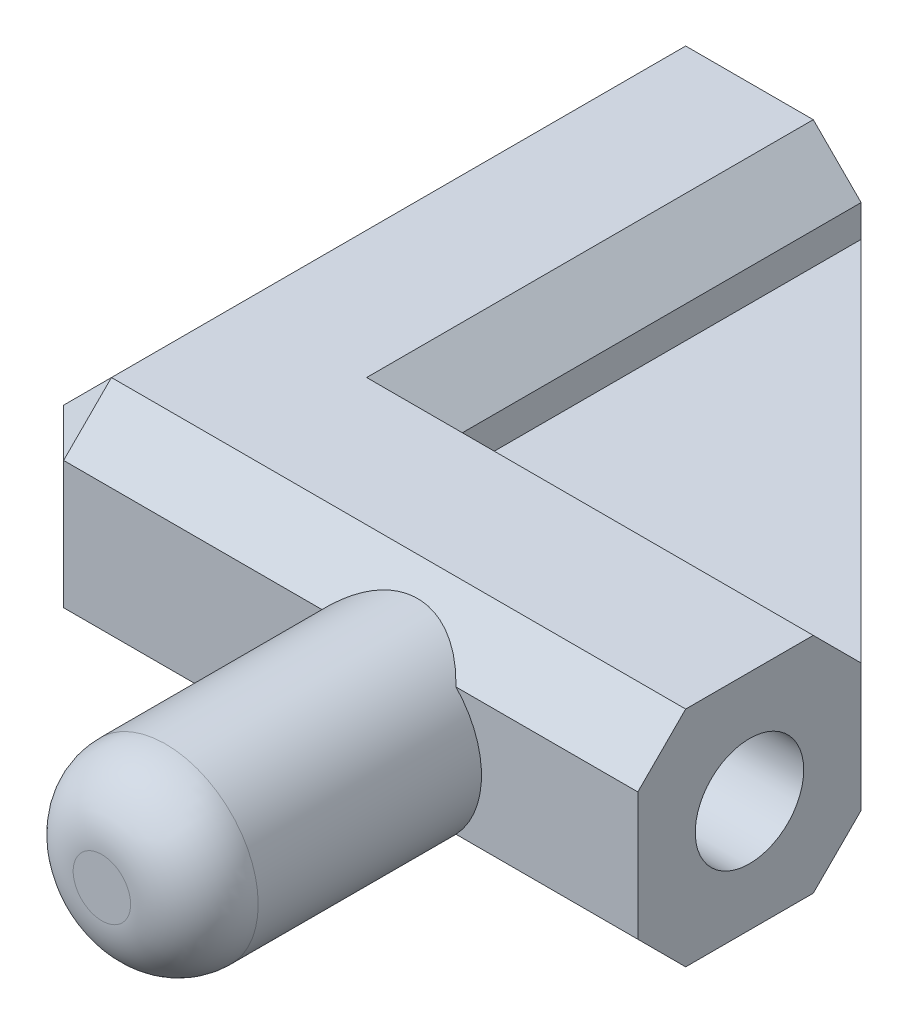
ISO-10303-21;
HEADER;
FILE_DESCRIPTION(('STEP AP214'),'2;1');
FILE_NAME('part.step','',(''),(''),'','','');
FILE_SCHEMA(('AUTOMOTIVE_DESIGN { 1 0 10303 214 1 1 1 1 }'));
ENDSEC;
DATA;
#1=APPLICATION_CONTEXT('core data for automotive mechanical design processes');
#2=APPLICATION_PROTOCOL_DEFINITION('international standard','automotive_design',2000,#1);
#3=PRODUCT_CONTEXT('',#1,'mechanical');
#4=PRODUCT('Part','Part','',(#3));
#5=PRODUCT_RELATED_PRODUCT_CATEGORY('part','',(#4));
#6=PRODUCT_DEFINITION_FORMATION('','',#4);
#7=PRODUCT_DEFINITION_CONTEXT('part definition',#1,'design');
#8=PRODUCT_DEFINITION('design','',#6,#7);
#9=PRODUCT_DEFINITION_SHAPE('','',#8);
#10=(LENGTH_UNIT() NAMED_UNIT(*) SI_UNIT(.MILLI.,.METRE.));
#11=(NAMED_UNIT(*) PLANE_ANGLE_UNIT() SI_UNIT($,.RADIAN.));
#12=(NAMED_UNIT(*) SI_UNIT($,.STERADIAN.) SOLID_ANGLE_UNIT());
#13=UNCERTAINTY_MEASURE_WITH_UNIT(LENGTH_MEASURE(1.E-05),#10,'distance_accuracy_value','');
#14=(GEOMETRIC_REPRESENTATION_CONTEXT(3) GLOBAL_UNCERTAINTY_ASSIGNED_CONTEXT((#13)) GLOBAL_UNIT_ASSIGNED_CONTEXT((#10,
#11,#12)) REPRESENTATION_CONTEXT('',''));
#15=CARTESIAN_POINT('',(0.,0.,0.));
#16=DIRECTION('',(0.,0.,1.));
#17=DIRECTION('',(1.,0.,0.));
#18=AXIS2_PLACEMENT_3D('',#15,#16,#17);
#19=CARTESIAN_POINT('',(-3.5,3.5,3.5));
#20=DIRECTION('',(0.,0.,-1.));
#21=DIRECTION('',(-1.,0.,0.));
#22=AXIS2_PLACEMENT_3D('',#19,#20,#21);
#23=PLANE('',#22);
#24=CARTESIAN_POINT('',(8.2,0.,3.5));
#25=DIRECTION('',(0.,0.,1.));
#26=DIRECTION('',(1.,0.,0.));
#27=AXIS2_PLACEMENT_3D('',#24,#25,#26);
#28=CIRCLE('',#27,2.9);
#29=CARTESIAN_POINT('',(10.3,-2.,3.5));
#30=VERTEX_POINT('',#29);
#31=CARTESIAN_POINT('',(10.3,2.,3.5));
#32=VERTEX_POINT('',#31);
#33=EDGE_CURVE('E165',#30,#32,#28,.T.);
#34=ORIENTED_EDGE('',*,*,#33,.F.);
#35=DIRECTION('',(1.,0.,0.));
#36=VECTOR('',#35,1.);
#37=CARTESIAN_POINT('',(-3.5,-2.,3.5));
#38=LINE('',#37,#36);
#39=CARTESIAN_POINT('',(16.,-2.,3.5));
#40=VERTEX_POINT('',#39);
#41=EDGE_CURVE('E195',#30,#40,#38,.T.);
#42=ORIENTED_EDGE('',*,*,#41,.T.);
#43=DIRECTION('',(0.,-1.,0.));
#44=VECTOR('',#43,1.);
#45=CARTESIAN_POINT('',(16.,3.5,3.5));
#46=LINE('',#45,#44);
#47=CARTESIAN_POINT('',(16.,2.,3.5));
#48=VERTEX_POINT('',#47);
#49=EDGE_CURVE('E399',#48,#40,#46,.T.);
#50=ORIENTED_EDGE('',*,*,#49,.F.);
#51=DIRECTION('',(-1.,0.,0.));
#52=VECTOR('',#51,1.);
#53=CARTESIAN_POINT('',(-3.5,2.,3.5));
#54=LINE('',#53,#52);
#55=EDGE_CURVE('E186',#48,#32,#54,.T.);
#56=ORIENTED_EDGE('',*,*,#55,.T.);
#57=EDGE_LOOP('',(#34,#42,#50,#56));
#58=FACE_BOUND('',#57,.T.);
#59=ADVANCED_FACE('F38',(#58),#23,.F.);
#60=CARTESIAN_POINT('',(6.1,2.,3.5));
#61=VERTEX_POINT('',#60);
#62=CARTESIAN_POINT('',(6.1,-2.,3.5));
#63=VERTEX_POINT('',#62);
#64=EDGE_CURVE('E53',#61,#63,#28,.T.);
#65=ORIENTED_EDGE('',*,*,#64,.F.);
#66=CARTESIAN_POINT('',(-2.,2.,3.5));
#67=VERTEX_POINT('',#66);
#68=EDGE_CURVE('E175',#61,#67,#54,.T.);
#69=ORIENTED_EDGE('',*,*,#68,.T.);
#70=DIRECTION('',(0.,-1.,0.));
#71=VECTOR('',#70,1.);
#72=CARTESIAN_POINT('',(-2.,3.5,3.5));
#73=LINE('',#72,#71);
#74=CARTESIAN_POINT('',(-2.,-2.,3.5));
#75=VERTEX_POINT('',#74);
#76=EDGE_CURVE('E189',#67,#75,#73,.T.);
#77=ORIENTED_EDGE('',*,*,#76,.T.);
#78=EDGE_CURVE('E178',#75,#63,#38,.T.);
#79=ORIENTED_EDGE('',*,*,#78,.T.);
#80=EDGE_LOOP('',(#65,#69,#77,#79));
#81=FACE_BOUND('',#80,.T.);
#82=ADVANCED_FACE('F174',(#81),#23,.F.);
#83=CARTESIAN_POINT('',(16.,3.5,-3.5));
#84=DIRECTION('',(0.,0.,1.));
#85=DIRECTION('',(1.,0.,0.));
#86=AXIS2_PLACEMENT_3D('',#83,#84,#85);
#87=PLANE('',#86);
#88=DIRECTION('',(0.,-1.,0.));
#89=VECTOR('',#88,1.);
#90=CARTESIAN_POINT('',(16.,3.5,-3.5));
#91=LINE('',#90,#89);
#92=CARTESIAN_POINT('',(16.,-1.,-3.5));
#93=VERTEX_POINT('',#92);
#94=CARTESIAN_POINT('',(16.,-2.,-3.5));
#95=VERTEX_POINT('',#94);
#96=EDGE_CURVE('E396',#93,#95,#91,.T.);
#97=ORIENTED_EDGE('',*,*,#96,.T.);
#98=DIRECTION('',(-1.,0.,0.));
#99=VECTOR('',#98,1.);
#100=CARTESIAN_POINT('',(16.,-2.,-3.5));
#101=LINE('',#100,#99);
#102=CARTESIAN_POINT('',(3.5,-2.,-3.5));
#103=VERTEX_POINT('',#102);
#104=EDGE_CURVE('E187',#95,#103,#101,.T.);
#105=ORIENTED_EDGE('',*,*,#104,.T.);
#106=DIRECTION('',(0.,-1.,0.));
#107=VECTOR('',#106,1.);
#108=CARTESIAN_POINT('',(3.5,3.5,-3.5));
#109=LINE('',#108,#107);
#110=CARTESIAN_POINT('',(3.5,-1.,-3.5));
#111=VERTEX_POINT('',#110);
#112=EDGE_CURVE('E381',#111,#103,#109,.T.);
#113=ORIENTED_EDGE('',*,*,#112,.F.);
#114=DIRECTION('',(1.,0.,0.));
#115=VECTOR('',#114,1.);
#116=CARTESIAN_POINT('',(16.,-1.,-3.5));
#117=LINE('',#116,#115);
#118=EDGE_CURVE('E425',#111,#93,#117,.T.);
#119=ORIENTED_EDGE('',*,*,#118,.T.);
#120=EDGE_LOOP('',(#97,#105,#113,#119));
#121=FACE_BOUND('',#120,.T.);
#122=ADVANCED_FACE('F240',(#121),#87,.F.);
#123=CARTESIAN_POINT('',(3.5,3.5,-3.5));
#124=DIRECTION('',(-1.,0.,0.));
#125=DIRECTION('',(0.,0.,1.));
#126=AXIS2_PLACEMENT_3D('',#123,#124,#125);
#127=PLANE('',#126);
#128=ORIENTED_EDGE('',*,*,#112,.T.);
#129=DIRECTION('',(0.,0.,-1.));
#130=VECTOR('',#129,1.);
#131=CARTESIAN_POINT('',(3.5,-2.,-3.5));
#132=LINE('',#131,#130);
#133=CARTESIAN_POINT('',(3.5,-2.,-16.));
#134=VERTEX_POINT('',#133);
#135=EDGE_CURVE('E353',#103,#134,#132,.T.);
#136=ORIENTED_EDGE('',*,*,#135,.T.);
#137=DIRECTION('',(0.,-1.,0.));
#138=VECTOR('',#137,1.);
#139=CARTESIAN_POINT('',(3.5,3.5,-16.));
#140=LINE('',#139,#138);
#141=CARTESIAN_POINT('',(3.5,-1.,-16.));
#142=VERTEX_POINT('',#141);
#143=EDGE_CURVE('E378',#142,#134,#140,.T.);
#144=ORIENTED_EDGE('',*,*,#143,.F.);
#145=DIRECTION('',(0.,0.,1.));
#146=VECTOR('',#145,1.);
#147=CARTESIAN_POINT('',(3.5,-1.,-3.5));
#148=LINE('',#147,#146);
#149=EDGE_CURVE('E204',#142,#111,#148,.T.);
#150=ORIENTED_EDGE('',*,*,#149,.T.);
#151=EDGE_LOOP('',(#128,#136,#144,#150));
#152=FACE_BOUND('',#151,.T.);
#153=ADVANCED_FACE('F251',(#152),#127,.F.);
#154=CARTESIAN_POINT('',(3.5,3.5,-16.));
#155=DIRECTION('',(0.,0.,1.));
#156=DIRECTION('',(1.,0.,0.));
#157=AXIS2_PLACEMENT_3D('',#154,#155,#156);
#158=PLANE('',#157);
#159=CARTESIAN_POINT('',(0.,0.,-16.));
#160=DIRECTION('',(0.,0.,-1.));
#161=DIRECTION('',(-1.,0.,0.));
#162=AXIS2_PLACEMENT_3D('',#159,#160,#161);
#163=CIRCLE('',#162,1.7);
#164=CARTESIAN_POINT('',(-1.7,0.,-16.));
#165=VERTEX_POINT('',#164);
#166=EDGE_CURVE('E444',#165,#165,#163,.T.);
#167=ORIENTED_EDGE('',*,*,#166,.F.);
#168=EDGE_LOOP('',(#167));
#169=FACE_BOUND('',#168,.T.);
#170=DIRECTION('',(-1.,0.,0.));
#171=VECTOR('',#170,1.);
#172=CARTESIAN_POINT('',(3.5,3.5,-16.));
#173=LINE('',#172,#171);
#174=CARTESIAN_POINT('',(2.,3.5,-16.));
#175=VERTEX_POINT('',#174);
#176=CARTESIAN_POINT('',(-2.,3.5,-16.));
#177=VERTEX_POINT('',#176);
#178=EDGE_CURVE('E388',#175,#177,#173,.T.);
#179=ORIENTED_EDGE('',*,*,#178,.F.);
#180=DIRECTION('',(0.707106781186546,-0.707106781186549,0.));
#181=VECTOR('',#180,1.);
#182=CARTESIAN_POINT('',(2.,3.5,-16.));
#183=LINE('',#182,#181);
#184=CARTESIAN_POINT('',(3.5,2.,-16.));
#185=VERTEX_POINT('',#184);
#186=EDGE_CURVE('E349',#175,#185,#183,.T.);
#187=ORIENTED_EDGE('',*,*,#186,.T.);
#188=CARTESIAN_POINT('',(3.5,1.,-16.));
#189=VERTEX_POINT('',#188);
#190=EDGE_CURVE('E384',#185,#189,#140,.T.);
#191=ORIENTED_EDGE('',*,*,#190,.T.);
#192=DIRECTION('',(0.,-1.,0.));
#193=VECTOR('',#192,1.);
#194=CARTESIAN_POINT('',(3.5,1.,-16.));
#195=LINE('',#194,#193);
#196=EDGE_CURVE('E383',#189,#142,#195,.T.);
#197=ORIENTED_EDGE('',*,*,#196,.T.);
#198=ORIENTED_EDGE('',*,*,#143,.T.);
#199=DIRECTION('',(0.707106781186548,0.707106781186547,0.));
#200=VECTOR('',#199,1.);
#201=CARTESIAN_POINT('',(3.5,-2.,-16.));
#202=LINE('',#201,#200);
#203=CARTESIAN_POINT('',(2.,-3.5,-16.));
#204=VERTEX_POINT('',#203);
#205=EDGE_CURVE('E342',#134,#204,#202,.F.);
#206=ORIENTED_EDGE('',*,*,#205,.T.);
#207=DIRECTION('',(-1.,0.,0.));
#208=VECTOR('',#207,1.);
#209=CARTESIAN_POINT('',(3.5,-3.5,-16.));
#210=LINE('',#209,#208);
#211=CARTESIAN_POINT('',(-2.,-3.5,-16.));
#212=VERTEX_POINT('',#211);
#213=EDGE_CURVE('E369',#204,#212,#210,.T.);
#214=ORIENTED_EDGE('',*,*,#213,.T.);
#215=DIRECTION('',(0.707106781186547,-0.707106781186548,0.));
#216=VECTOR('',#215,1.);
#217=CARTESIAN_POINT('',(-3.5,-2.,-16.));
#218=LINE('',#217,#216);
#219=CARTESIAN_POINT('',(-3.5,-2.,-16.));
#220=VERTEX_POINT('',#219);
#221=EDGE_CURVE('E339',#212,#220,#218,.F.);
#222=ORIENTED_EDGE('',*,*,#221,.T.);
#223=DIRECTION('',(0.,-1.,0.));
#224=VECTOR('',#223,1.);
#225=CARTESIAN_POINT('',(-3.5,3.5,-16.));
#226=LINE('',#225,#224);
#227=CARTESIAN_POINT('',(-3.5,2.,-16.));
#228=VERTEX_POINT('',#227);
#229=EDGE_CURVE('E402',#228,#220,#226,.T.);
#230=ORIENTED_EDGE('',*,*,#229,.F.);
#231=DIRECTION('',(0.707106781186547,0.707106781186548,0.));
#232=VECTOR('',#231,1.);
#233=CARTESIAN_POINT('',(-2.,3.5,-16.));
#234=LINE('',#233,#232);
#235=EDGE_CURVE('E332',#228,#177,#234,.T.);
#236=ORIENTED_EDGE('',*,*,#235,.T.);
#237=EDGE_LOOP('',(#179,#187,#191,#197,#198,#206,#214,#222,#230,#236));
#238=FACE_BOUND('',#237,.T.);
#239=ADVANCED_FACE('F248',(#169,#238),#158,.F.);
#240=CARTESIAN_POINT('',(-3.5,3.5,-16.));
#241=DIRECTION('',(1.,0.,0.));
#242=DIRECTION('',(0.,0.,-1.));
#243=AXIS2_PLACEMENT_3D('',#240,#241,#242);
#244=PLANE('',#243);
#245=ORIENTED_EDGE('',*,*,#229,.T.);
#246=DIRECTION('',(0.,0.,1.));
#247=VECTOR('',#246,1.);
#248=CARTESIAN_POINT('',(-3.5,-2.,-16.));
#249=LINE('',#248,#247);
#250=CARTESIAN_POINT('',(-3.5,-2.,2.));
#251=VERTEX_POINT('',#250);
#252=EDGE_CURVE('E61',#220,#251,#249,.T.);
#253=ORIENTED_EDGE('',*,*,#252,.T.);
#254=DIRECTION('',(0.,1.,0.));
#255=VECTOR('',#254,1.);
#256=CARTESIAN_POINT('',(-3.5,3.5,2.));
#257=LINE('',#256,#255);
#258=CARTESIAN_POINT('',(-3.5,2.,2.));
#259=VERTEX_POINT('',#258);
#260=EDGE_CURVE('E199',#251,#259,#257,.T.);
#261=ORIENTED_EDGE('',*,*,#260,.T.);
#262=DIRECTION('',(0.,0.,-1.));
#263=VECTOR('',#262,1.);
#264=CARTESIAN_POINT('',(-3.5,2.,-16.));
#265=LINE('',#264,#263);
#266=EDGE_CURVE('E197',#259,#228,#265,.T.);
#267=ORIENTED_EDGE('',*,*,#266,.T.);
#268=EDGE_LOOP('',(#245,#253,#261,#267));
#269=FACE_BOUND('',#268,.T.);
#270=ADVANCED_FACE('F245',(#269),#244,.F.);
#271=CARTESIAN_POINT('',(16.,3.5,3.5));
#272=DIRECTION('',(-1.,0.,0.));
#273=DIRECTION('',(0.,0.,1.));
#274=AXIS2_PLACEMENT_3D('',#271,#272,#273);
#275=PLANE('',#274);
#276=CARTESIAN_POINT('',(16.,0.,0.));
#277=DIRECTION('',(1.,0.,0.));
#278=DIRECTION('',(0.,0.,-1.));
#279=AXIS2_PLACEMENT_3D('',#276,#277,#278);
#280=CIRCLE('',#279,1.7);
#281=CARTESIAN_POINT('',(16.,0.,-1.7));
#282=VERTEX_POINT('',#281);
#283=EDGE_CURVE('E440',#282,#282,#280,.T.);
#284=ORIENTED_EDGE('',*,*,#283,.F.);
#285=EDGE_LOOP('',(#284));
#286=FACE_BOUND('',#285,.T.);
#287=CARTESIAN_POINT('',(16.,2.,-3.5));
#288=VERTEX_POINT('',#287);
#289=CARTESIAN_POINT('',(16.,1.,-3.5));
#290=VERTEX_POINT('',#289);
#291=EDGE_CURVE('E397',#288,#290,#91,.T.);
#292=ORIENTED_EDGE('',*,*,#291,.F.);
#293=DIRECTION('',(0.,0.707106781186548,0.707106781186547));
#294=VECTOR('',#293,1.);
#295=CARTESIAN_POINT('',(16.,3.5,-2.));
#296=LINE('',#295,#294);
#297=CARTESIAN_POINT('',(16.,3.5,-2.));
#298=VERTEX_POINT('',#297);
#299=EDGE_CURVE('E340',#288,#298,#296,.T.);
#300=ORIENTED_EDGE('',*,*,#299,.T.);
#301=DIRECTION('',(0.,0.,-1.));
#302=VECTOR('',#301,1.);
#303=CARTESIAN_POINT('',(16.,3.5,3.5));
#304=LINE('',#303,#302);
#305=CARTESIAN_POINT('',(16.,3.5,2.));
#306=VERTEX_POINT('',#305);
#307=EDGE_CURVE('E385',#306,#298,#304,.T.);
#308=ORIENTED_EDGE('',*,*,#307,.F.);
#309=DIRECTION('',(0.,-0.707106781186548,0.707106781186547));
#310=VECTOR('',#309,1.);
#311=CARTESIAN_POINT('',(16.,3.5,2.));
#312=LINE('',#311,#310);
#313=EDGE_CURVE('E414',#306,#48,#312,.T.);
#314=ORIENTED_EDGE('',*,*,#313,.T.);
#315=ORIENTED_EDGE('',*,*,#49,.T.);
#316=DIRECTION('',(0.,0.707106781186547,0.707106781186548));
#317=VECTOR('',#316,1.);
#318=CARTESIAN_POINT('',(16.,-2.,3.5));
#319=LINE('',#318,#317);
#320=CARTESIAN_POINT('',(16.,-3.5,2.));
#321=VERTEX_POINT('',#320);
#322=EDGE_CURVE('E416',#40,#321,#319,.F.);
#323=ORIENTED_EDGE('',*,*,#322,.T.);
#324=DIRECTION('',(0.,0.,-1.));
#325=VECTOR('',#324,1.);
#326=CARTESIAN_POINT('',(16.,-3.5,3.5));
#327=LINE('',#326,#325);
#328=CARTESIAN_POINT('',(16.,-3.5,-2.));
#329=VERTEX_POINT('',#328);
#330=EDGE_CURVE('E392',#321,#329,#327,.T.);
#331=ORIENTED_EDGE('',*,*,#330,.T.);
#332=DIRECTION('',(0.,-0.707106781186547,0.707106781186548));
#333=VECTOR('',#332,1.);
#334=CARTESIAN_POINT('',(16.,-2.,-3.5));
#335=LINE('',#334,#333);
#336=EDGE_CURVE('E344',#329,#95,#335,.F.);
#337=ORIENTED_EDGE('',*,*,#336,.T.);
#338=ORIENTED_EDGE('',*,*,#96,.F.);
#339=DIRECTION('',(0.,-1.,0.));
#340=VECTOR('',#339,1.);
#341=CARTESIAN_POINT('',(16.,1.,-3.5));
#342=LINE('',#341,#340);
#343=EDGE_CURVE('E437',#290,#93,#342,.T.);
#344=ORIENTED_EDGE('',*,*,#343,.F.);
#345=EDGE_LOOP('',(#292,#300,#308,#314,#315,#323,#331,#337,#338,#344));
#346=FACE_BOUND('',#345,.T.);
#347=ADVANCED_FACE('F243',(#286,#346),#275,.F.);
#348=CARTESIAN_POINT('',(3.5,2.,-3.5));
#349=VERTEX_POINT('',#348);
#350=CARTESIAN_POINT('',(3.5,1.,-3.5));
#351=VERTEX_POINT('',#350);
#352=EDGE_CURVE('E394',#349,#351,#109,.T.);
#353=ORIENTED_EDGE('',*,*,#352,.F.);
#354=DIRECTION('',(1.,0.,0.));
#355=VECTOR('',#354,1.);
#356=CARTESIAN_POINT('',(16.,2.,-3.5));
#357=LINE('',#356,#355);
#358=EDGE_CURVE('E412',#349,#288,#357,.T.);
#359=ORIENTED_EDGE('',*,*,#358,.T.);
#360=ORIENTED_EDGE('',*,*,#291,.T.);
#361=DIRECTION('',(1.,0.,0.));
#362=VECTOR('',#361,1.);
#363=CARTESIAN_POINT('',(16.,1.,-3.5));
#364=LINE('',#363,#362);
#365=EDGE_CURVE('E465',#351,#290,#364,.T.);
#366=ORIENTED_EDGE('',*,*,#365,.F.);
#367=EDGE_LOOP('',(#353,#359,#360,#366));
#368=FACE_BOUND('',#367,.T.);
#369=ADVANCED_FACE('F509',(#368),#87,.F.);
#370=ORIENTED_EDGE('',*,*,#190,.F.);
#371=DIRECTION('',(0.,0.,1.));
#372=VECTOR('',#371,1.);
#373=CARTESIAN_POINT('',(3.5,2.,-3.5));
#374=LINE('',#373,#372);
#375=EDGE_CURVE('E351',#185,#349,#374,.T.);
#376=ORIENTED_EDGE('',*,*,#375,.T.);
#377=ORIENTED_EDGE('',*,*,#352,.T.);
#378=DIRECTION('',(0.,0.,1.));
#379=VECTOR('',#378,1.);
#380=CARTESIAN_POINT('',(3.5,1.,-3.5));
#381=LINE('',#380,#379);
#382=EDGE_CURVE('E431',#189,#351,#381,.T.);
#383=ORIENTED_EDGE('',*,*,#382,.F.);
#384=EDGE_LOOP('',(#370,#376,#377,#383));
#385=FACE_BOUND('',#384,.T.);
#386=ADVANCED_FACE('F504',(#385),#127,.F.);
#387=CARTESIAN_POINT('',(0.,3.5,0.));
#388=DIRECTION('',(0.,1.,0.));
#389=DIRECTION('',(0.,0.,1.));
#390=AXIS2_PLACEMENT_3D('',#387,#388,#389);
#391=PLANE('',#390);
#392=ORIENTED_EDGE('',*,*,#307,.T.);
#393=DIRECTION('',(-1.,0.,0.));
#394=VECTOR('',#393,1.);
#395=CARTESIAN_POINT('',(3.5,3.5,-2.));
#396=LINE('',#395,#394);
#397=CARTESIAN_POINT('',(2.,3.5,-2.));
#398=VERTEX_POINT('',#397);
#399=EDGE_CURVE('E409',#298,#398,#396,.T.);
#400=ORIENTED_EDGE('',*,*,#399,.T.);
#401=DIRECTION('',(0.,0.,-1.));
#402=VECTOR('',#401,1.);
#403=CARTESIAN_POINT('',(2.,3.5,-16.));
#404=LINE('',#403,#402);
#405=EDGE_CURVE('E407',#398,#175,#404,.T.);
#406=ORIENTED_EDGE('',*,*,#405,.T.);
#407=ORIENTED_EDGE('',*,*,#178,.T.);
#408=DIRECTION('',(0.,0.,1.));
#409=VECTOR('',#408,1.);
#410=CARTESIAN_POINT('',(-2.,3.5,3.5));
#411=LINE('',#410,#409);
#412=CARTESIAN_POINT('',(-2.,3.5,2.));
#413=VERTEX_POINT('',#412);
#414=EDGE_CURVE('E334',#177,#413,#411,.T.);
#415=ORIENTED_EDGE('',*,*,#414,.T.);
#416=DIRECTION('',(1.,0.,0.));
#417=VECTOR('',#416,1.);
#418=CARTESIAN_POINT('',(16.,3.5,2.));
#419=LINE('',#418,#417);
#420=EDGE_CURVE('E405',#413,#306,#419,.T.);
#421=ORIENTED_EDGE('',*,*,#420,.T.);
#422=EDGE_LOOP('',(#392,#400,#406,#407,#415,#421));
#423=FACE_BOUND('',#422,.T.);
#424=ADVANCED_FACE('F501',(#423),#391,.T.);
#425=CARTESIAN_POINT('',(0.,-3.5,0.));
#426=DIRECTION('',(0.,1.,0.));
#427=DIRECTION('',(0.,0.,1.));
#428=AXIS2_PLACEMENT_3D('',#425,#426,#427);
#429=PLANE('',#428);
#430=ORIENTED_EDGE('',*,*,#213,.F.);
#431=DIRECTION('',(0.,0.,1.));
#432=VECTOR('',#431,1.);
#433=CARTESIAN_POINT('',(2.,-3.5,0.));
#434=LINE('',#433,#432);
#435=CARTESIAN_POINT('',(2.,-3.5,-2.));
#436=VERTEX_POINT('',#435);
#437=EDGE_CURVE('E190',#204,#436,#434,.T.);
#438=ORIENTED_EDGE('',*,*,#437,.T.);
#439=DIRECTION('',(1.,0.,0.));
#440=VECTOR('',#439,1.);
#441=CARTESIAN_POINT('',(0.,-3.5,-2.));
#442=LINE('',#441,#440);
#443=EDGE_CURVE('E360',#436,#329,#442,.T.);
#444=ORIENTED_EDGE('',*,*,#443,.T.);
#445=ORIENTED_EDGE('',*,*,#330,.F.);
#446=DIRECTION('',(-1.,0.,0.));
#447=VECTOR('',#446,1.);
#448=CARTESIAN_POINT('',(0.,-3.5,2.));
#449=LINE('',#448,#447);
#450=CARTESIAN_POINT('',(-2.,-3.5,2.));
#451=VERTEX_POINT('',#450);
#452=EDGE_CURVE('E358',#321,#451,#449,.T.);
#453=ORIENTED_EDGE('',*,*,#452,.T.);
#454=DIRECTION('',(0.,0.,-1.));
#455=VECTOR('',#454,1.);
#456=CARTESIAN_POINT('',(-2.,-3.5,0.));
#457=LINE('',#456,#455);
#458=EDGE_CURVE('E356',#451,#212,#457,.T.);
#459=ORIENTED_EDGE('',*,*,#458,.T.);
#460=EDGE_LOOP('',(#430,#438,#444,#445,#453,#459));
#461=FACE_BOUND('',#460,.T.);
#462=ADVANCED_FACE('F365',(#461),#429,.F.);
#463=CARTESIAN_POINT('',(0.,0.,-2.));
#464=DIRECTION('',(0.,0.,-1.));
#465=DIRECTION('',(-1.,0.,0.));
#466=AXIS2_PLACEMENT_3D('',#463,#464,#465);
#467=CYLINDRICAL_SURFACE('',#466,1.7);
#468=CARTESIAN_POINT('',(0.,0.,-2.));
#469=DIRECTION('',(0.,0.,-1.));
#470=DIRECTION('',(-1.,0.,0.));
#471=AXIS2_PLACEMENT_3D('',#468,#469,#470);
#472=CIRCLE('',#471,1.7);
#473=CARTESIAN_POINT('',(-1.7,0.,-2.));
#474=VERTEX_POINT('',#473);
#475=EDGE_CURVE('E447',#474,#474,#472,.T.);
#476=ORIENTED_EDGE('',*,*,#475,.F.);
#477=EDGE_LOOP('',(#476));
#478=FACE_BOUND('',#477,.T.);
#479=ORIENTED_EDGE('',*,*,#166,.T.);
#480=EDGE_LOOP('',(#479));
#481=FACE_BOUND('',#480,.T.);
#482=ADVANCED_FACE('F496',(#478,#481),#467,.F.);
#483=CARTESIAN_POINT('',(0.,0.,-2.));
#484=DIRECTION('',(0.,0.,-1.));
#485=DIRECTION('',(-1.,0.,0.));
#486=AXIS2_PLACEMENT_3D('',#483,#484,#485);
#487=PLANE('',#486);
#488=ORIENTED_EDGE('',*,*,#475,.T.);
#489=EDGE_LOOP('',(#488));
#490=FACE_BOUND('',#489,.T.);
#491=ADVANCED_FACE('F492',(#490),#487,.T.);
#492=CARTESIAN_POINT('',(2.,0.,0.));
#493=DIRECTION('',(1.,0.,0.));
#494=DIRECTION('',(0.,0.,-1.));
#495=AXIS2_PLACEMENT_3D('',#492,#493,#494);
#496=CYLINDRICAL_SURFACE('',#495,1.7);
#497=CARTESIAN_POINT('',(2.,0.,0.));
#498=DIRECTION('',(1.,0.,0.));
#499=DIRECTION('',(0.,0.,-1.));
#500=AXIS2_PLACEMENT_3D('',#497,#498,#499);
#501=CIRCLE('',#500,1.7);
#502=CARTESIAN_POINT('',(2.,0.,-1.7));
#503=VERTEX_POINT('',#502);
#504=EDGE_CURVE('E441',#503,#503,#501,.T.);
#505=ORIENTED_EDGE('',*,*,#504,.F.);
#506=EDGE_LOOP('',(#505));
#507=FACE_BOUND('',#506,.T.);
#508=ORIENTED_EDGE('',*,*,#283,.T.);
#509=EDGE_LOOP('',(#508));
#510=FACE_BOUND('',#509,.T.);
#511=ADVANCED_FACE('F488',(#507,#510),#496,.F.);
#512=CARTESIAN_POINT('',(2.,0.,0.));
#513=DIRECTION('',(1.,0.,0.));
#514=DIRECTION('',(0.,0.,-1.));
#515=AXIS2_PLACEMENT_3D('',#512,#513,#514);
#516=PLANE('',#515);
#517=ORIENTED_EDGE('',*,*,#504,.T.);
#518=EDGE_LOOP('',(#517));
#519=FACE_BOUND('',#518,.T.);
#520=ADVANCED_FACE('F485',(#519),#516,.T.);
#521=CARTESIAN_POINT('',(3.5,1.,-16.));
#522=DIRECTION('',(-0.707106781186547,0.,0.707106781186547));
#523=DIRECTION('',(0.707106781186548,0.,0.707106781186548));
#524=AXIS2_PLACEMENT_3D('',#521,#522,#523);
#525=PLANE('',#524);
#526=DIRECTION('',(-0.707106781186547,0.,-0.707106781186547));
#527=VECTOR('',#526,1.);
#528=CARTESIAN_POINT('',(3.5,-1.,-16.));
#529=LINE('',#528,#527);
#530=EDGE_CURVE('E429',#93,#142,#529,.T.);
#531=ORIENTED_EDGE('',*,*,#530,.T.);
#532=ORIENTED_EDGE('',*,*,#196,.F.);
#533=DIRECTION('',(-0.707106781186547,0.,-0.707106781186547));
#534=VECTOR('',#533,1.);
#535=CARTESIAN_POINT('',(3.5,1.,-16.));
#536=LINE('',#535,#534);
#537=EDGE_CURVE('E438',#290,#189,#536,.T.);
#538=ORIENTED_EDGE('',*,*,#537,.F.);
#539=ORIENTED_EDGE('',*,*,#343,.T.);
#540=EDGE_LOOP('',(#531,#532,#538,#539));
#541=FACE_BOUND('',#540,.T.);
#542=ADVANCED_FACE('F474',(#541),#525,.F.);
#543=CARTESIAN_POINT('',(0.,1.,0.));
#544=DIRECTION('',(0.,1.,0.));
#545=DIRECTION('',(0.,0.,1.));
#546=AXIS2_PLACEMENT_3D('',#543,#544,#545);
#547=PLANE('',#546);
#548=ORIENTED_EDGE('',*,*,#382,.T.);
#549=ORIENTED_EDGE('',*,*,#365,.T.);
#550=ORIENTED_EDGE('',*,*,#537,.T.);
#551=EDGE_LOOP('',(#548,#549,#550));
#552=FACE_BOUND('',#551,.T.);
#553=ADVANCED_FACE('F470',(#552),#547,.T.);
#554=CARTESIAN_POINT('',(0.,-1.,0.));
#555=DIRECTION('',(0.,1.,0.));
#556=DIRECTION('',(0.,0.,1.));
#557=AXIS2_PLACEMENT_3D('',#554,#555,#556);
#558=PLANE('',#557);
#559=ORIENTED_EDGE('',*,*,#149,.F.);
#560=ORIENTED_EDGE('',*,*,#530,.F.);
#561=ORIENTED_EDGE('',*,*,#118,.F.);
#562=EDGE_LOOP('',(#559,#560,#561));
#563=FACE_BOUND('',#562,.T.);
#564=ADVANCED_FACE('F268',(#563),#558,.F.);
#565=CARTESIAN_POINT('',(2.,3.5,0.));
#566=DIRECTION('',(0.707106781186549,0.707106781186546,0.));
#567=DIRECTION('',(0.,0.,1.));
#568=AXIS2_PLACEMENT_3D('',#565,#566,#567);
#569=PLANE('',#568);
#570=ORIENTED_EDGE('',*,*,#186,.F.);
#571=ORIENTED_EDGE('',*,*,#405,.F.);
#572=DIRECTION('',(0.577350269189625,-0.577350269189627,-0.577350269189625));
#573=VECTOR('',#572,1.);
#574=CARTESIAN_POINT('',(1.33333333333334,4.16666666666667,-1.33333333333334));
#575=LINE('',#574,#573);
#576=EDGE_CURVE('E202',#349,#398,#575,.F.);
#577=ORIENTED_EDGE('',*,*,#576,.F.);
#578=ORIENTED_EDGE('',*,*,#375,.F.);
#579=EDGE_LOOP('',(#570,#571,#577,#578));
#580=FACE_BOUND('',#579,.T.);
#581=ADVANCED_FACE('F262',(#580),#569,.T.);
#582=CARTESIAN_POINT('',(0.,3.5,-2.));
#583=DIRECTION('',(0.,0.707106781186547,-0.707106781186548));
#584=DIRECTION('',(1.,0.,0.));
#585=AXIS2_PLACEMENT_3D('',#582,#583,#584);
#586=PLANE('',#585);
#587=ORIENTED_EDGE('',*,*,#299,.F.);
#588=ORIENTED_EDGE('',*,*,#358,.F.);
#589=ORIENTED_EDGE('',*,*,#576,.T.);
#590=ORIENTED_EDGE('',*,*,#399,.F.);
#591=EDGE_LOOP('',(#587,#588,#589,#590));
#592=FACE_BOUND('',#591,.T.);
#593=ADVANCED_FACE('F254',(#592),#586,.T.);
#594=CARTESIAN_POINT('',(16.,-2.,-3.5));
#595=DIRECTION('',(0.,0.707106781186548,0.707106781186547));
#596=DIRECTION('',(-1.,0.,0.));
#597=AXIS2_PLACEMENT_3D('',#594,#595,#596);
#598=PLANE('',#597);
#599=ORIENTED_EDGE('',*,*,#336,.F.);
#600=ORIENTED_EDGE('',*,*,#443,.F.);
#601=DIRECTION('',(0.577350269189626,0.577350269189625,-0.577350269189626));
#602=VECTOR('',#601,1.);
#603=CARTESIAN_POINT('',(3.5,-2.,-3.5));
#604=LINE('',#603,#602);
#605=EDGE_CURVE('E205',#103,#436,#604,.F.);
#606=ORIENTED_EDGE('',*,*,#605,.F.);
#607=ORIENTED_EDGE('',*,*,#104,.F.);
#608=EDGE_LOOP('',(#599,#600,#606,#607));
#609=FACE_BOUND('',#608,.T.);
#610=ADVANCED_FACE('F261',(#609),#598,.F.);
#611=CARTESIAN_POINT('',(3.5,-2.,-3.5));
#612=DIRECTION('',(-0.707106781186547,0.707106781186548,0.));
#613=DIRECTION('',(0.,0.,-1.));
#614=AXIS2_PLACEMENT_3D('',#611,#612,#613);
#615=PLANE('',#614);
#616=ORIENTED_EDGE('',*,*,#605,.T.);
#617=ORIENTED_EDGE('',*,*,#437,.F.);
#618=ORIENTED_EDGE('',*,*,#205,.F.);
#619=ORIENTED_EDGE('',*,*,#135,.F.);
#620=EDGE_LOOP('',(#616,#617,#618,#619));
#621=FACE_BOUND('',#620,.T.);
#622=ADVANCED_FACE('F271',(#621),#615,.F.);
#623=CARTESIAN_POINT('',(-2.,3.5,0.));
#624=DIRECTION('',(-0.707106781186548,0.707106781186547,0.));
#625=DIRECTION('',(0.,0.,-1.));
#626=AXIS2_PLACEMENT_3D('',#623,#624,#625);
#627=PLANE('',#626);
#628=ORIENTED_EDGE('',*,*,#235,.F.);
#629=ORIENTED_EDGE('',*,*,#266,.F.);
#630=DIRECTION('',(-0.707106781186546,-0.707106781186548,0.));
#631=VECTOR('',#630,1.);
#632=CARTESIAN_POINT('',(-3.5,2.,2.));
#633=LINE('',#632,#631);
#634=EDGE_CURVE('E208',#413,#259,#633,.T.);
#635=ORIENTED_EDGE('',*,*,#634,.F.);
#636=ORIENTED_EDGE('',*,*,#414,.F.);
#637=EDGE_LOOP('',(#628,#629,#635,#636));
#638=FACE_BOUND('',#637,.T.);
#639=ADVANCED_FACE('F277',(#638),#627,.T.);
#640=CARTESIAN_POINT('',(0.,3.5,2.));
#641=DIRECTION('',(0.,0.707106781186547,0.707106781186548));
#642=DIRECTION('',(-1.,0.,0.));
#643=AXIS2_PLACEMENT_3D('',#640,#641,#642);
#644=PLANE('',#643);
#645=ORIENTED_EDGE('',*,*,#68,.F.);
#646=CARTESIAN_POINT('',(8.2,0.,5.49999999999999));
#647=DIRECTION('',(0.,0.707106781186547,0.707106781186548));
#648=DIRECTION('',(0.,-0.707106781186548,0.707106781186547));
#649=AXIS2_PLACEMENT_3D('',#646,#647,#648);
#650=ELLIPSE('',#649,4.10121933088197,2.9);
#651=EDGE_CURVE('E162',#61,#32,#650,.F.);
#652=ORIENTED_EDGE('',*,*,#651,.T.);
#653=ORIENTED_EDGE('',*,*,#55,.F.);
#654=ORIENTED_EDGE('',*,*,#313,.F.);
#655=ORIENTED_EDGE('',*,*,#420,.F.);
#656=DIRECTION('',(0.,0.707106781186548,-0.707106781186547));
#657=VECTOR('',#656,1.);
#658=CARTESIAN_POINT('',(-2.,2.75,2.75));
#659=LINE('',#658,#657);
#660=EDGE_CURVE('E184',#67,#413,#659,.T.);
#661=ORIENTED_EDGE('',*,*,#660,.F.);
#662=EDGE_LOOP('',(#645,#652,#653,#654,#655,#661));
#663=FACE_BOUND('',#662,.T.);
#664=ADVANCED_FACE('F181',(#663),#644,.T.);
#665=CARTESIAN_POINT('',(-3.5,2.,2.));
#666=DIRECTION('',(-0.577350269189627,0.577350269189624,0.577350269189626));
#667=DIRECTION('',(0.707106781186546,0.,0.707106781186548));
#668=AXIS2_PLACEMENT_3D('',#665,#666,#667);
#669=PLANE('',#668);
#670=ORIENTED_EDGE('',*,*,#660,.T.);
#671=ORIENTED_EDGE('',*,*,#634,.T.);
#672=DIRECTION('',(-0.707106781186546,0.,-0.707106781186548));
#673=VECTOR('',#672,1.);
#674=CARTESIAN_POINT('',(-3.5,2.,2.));
#675=LINE('',#674,#673);
#676=EDGE_CURVE('E217',#67,#259,#675,.T.);
#677=ORIENTED_EDGE('',*,*,#676,.F.);
#678=EDGE_LOOP('',(#670,#671,#677));
#679=FACE_BOUND('',#678,.T.);
#680=ADVANCED_FACE('F312',(#679),#669,.T.);
#681=CARTESIAN_POINT('',(-3.5,-2.,-16.));
#682=DIRECTION('',(0.707106781186548,0.707106781186547,0.));
#683=DIRECTION('',(0.,0.,1.));
#684=AXIS2_PLACEMENT_3D('',#681,#682,#683);
#685=PLANE('',#684);
#686=ORIENTED_EDGE('',*,*,#221,.F.);
#687=ORIENTED_EDGE('',*,*,#458,.F.);
#688=DIRECTION('',(-0.707106781186547,0.707106781186548,0.));
#689=VECTOR('',#688,1.);
#690=CARTESIAN_POINT('',(-2.,-3.5,2.));
#691=LINE('',#690,#689);
#692=EDGE_CURVE('E214',#251,#451,#691,.F.);
#693=ORIENTED_EDGE('',*,*,#692,.F.);
#694=ORIENTED_EDGE('',*,*,#252,.F.);
#695=EDGE_LOOP('',(#686,#687,#693,#694));
#696=FACE_BOUND('',#695,.T.);
#697=ADVANCED_FACE('F305',(#696),#685,.F.);
#698=CARTESIAN_POINT('',(-2.,3.5,3.5));
#699=DIRECTION('',(0.707106781186548,0.,-0.707106781186547));
#700=DIRECTION('',(0.,-1.,0.));
#701=AXIS2_PLACEMENT_3D('',#698,#699,#700);
#702=PLANE('',#701);
#703=ORIENTED_EDGE('',*,*,#676,.T.);
#704=ORIENTED_EDGE('',*,*,#260,.F.);
#705=DIRECTION('',(0.707106781186547,0.,0.707106781186548));
#706=VECTOR('',#705,1.);
#707=CARTESIAN_POINT('',(-2.75,-2.,2.75));
#708=LINE('',#707,#706);
#709=EDGE_CURVE('E211',#75,#251,#708,.F.);
#710=ORIENTED_EDGE('',*,*,#709,.F.);
#711=ORIENTED_EDGE('',*,*,#76,.F.);
#712=EDGE_LOOP('',(#703,#704,#710,#711));
#713=FACE_BOUND('',#712,.T.);
#714=ADVANCED_FACE('F298',(#713),#702,.F.);
#715=CARTESIAN_POINT('',(-2.,-3.5,2.));
#716=DIRECTION('',(-0.577350269189627,-0.577350269189626,0.577350269189624));
#717=DIRECTION('',(0.707106781186546,-0.707106781186549,0.));
#718=AXIS2_PLACEMENT_3D('',#715,#716,#717);
#719=PLANE('',#718);
#720=ORIENTED_EDGE('',*,*,#709,.T.);
#721=ORIENTED_EDGE('',*,*,#692,.T.);
#722=DIRECTION('',(0.,-0.707106781186547,-0.707106781186548));
#723=VECTOR('',#722,1.);
#724=CARTESIAN_POINT('',(-2.,-3.5,2.));
#725=LINE('',#724,#723);
#726=EDGE_CURVE('E179',#75,#451,#725,.T.);
#727=ORIENTED_EDGE('',*,*,#726,.F.);
#728=EDGE_LOOP('',(#720,#721,#727));
#729=FACE_BOUND('',#728,.T.);
#730=ADVANCED_FACE('F291',(#729),#719,.T.);
#731=CARTESIAN_POINT('',(-3.5,-2.,3.5));
#732=DIRECTION('',(0.,0.707106781186548,-0.707106781186547));
#733=DIRECTION('',(1.,0.,0.));
#734=AXIS2_PLACEMENT_3D('',#731,#732,#733);
#735=PLANE('',#734);
#736=ORIENTED_EDGE('',*,*,#41,.F.);
#737=CARTESIAN_POINT('',(8.2,0.,5.50000000000001));
#738=DIRECTION('',(0.,0.707106781186548,-0.707106781186547));
#739=DIRECTION('',(0.,0.707106781186547,0.707106781186548));
#740=AXIS2_PLACEMENT_3D('',#737,#738,#739);
#741=ELLIPSE('',#740,4.10121933088198,2.9);
#742=EDGE_CURVE('E170',#30,#63,#741,.T.);
#743=ORIENTED_EDGE('',*,*,#742,.T.);
#744=ORIENTED_EDGE('',*,*,#78,.F.);
#745=ORIENTED_EDGE('',*,*,#726,.T.);
#746=ORIENTED_EDGE('',*,*,#452,.F.);
#747=ORIENTED_EDGE('',*,*,#322,.F.);
#748=EDGE_LOOP('',(#736,#743,#744,#745,#746,#747));
#749=FACE_BOUND('',#748,.T.);
#750=ADVANCED_FACE('F285',(#749),#735,.F.);
#751=CARTESIAN_POINT('',(8.2,0.,12.5));
#752=DIRECTION('',(0.,0.,-1.));
#753=DIRECTION('',(-1.,0.,0.));
#754=AXIS2_PLACEMENT_3D('',#751,#752,#753);
#755=CYLINDRICAL_SURFACE('',#754,2.9);
#756=CARTESIAN_POINT('',(8.2,0.,10.5));
#757=DIRECTION('',(0.,0.,1.));
#758=DIRECTION('',(1.,0.,0.));
#759=AXIS2_PLACEMENT_3D('',#756,#757,#758);
#760=CIRCLE('',#759,2.9);
#761=CARTESIAN_POINT('',(11.1,0.,10.5));
#762=VERTEX_POINT('',#761);
#763=EDGE_CURVE('E11',#762,#762,#760,.F.);
#764=ORIENTED_EDGE('',*,*,#763,.T.);
#765=EDGE_LOOP('',(#764));
#766=FACE_BOUND('',#765,.T.);
#767=ORIENTED_EDGE('',*,*,#64,.T.);
#768=ORIENTED_EDGE('',*,*,#742,.F.);
#769=ORIENTED_EDGE('',*,*,#33,.T.);
#770=ORIENTED_EDGE('',*,*,#651,.F.);
#771=EDGE_LOOP('',(#767,#768,#769,#770));
#772=FACE_BOUND('',#771,.T.);
#773=ADVANCED_FACE('F163',(#766,#772),#755,.T.);
#774=CARTESIAN_POINT('',(8.2,0.,12.5));
#775=DIRECTION('',(0.,0.,1.));
#776=DIRECTION('',(1.,0.,0.));
#777=AXIS2_PLACEMENT_3D('',#774,#775,#776);
#778=PLANE('',#777);
#779=CARTESIAN_POINT('',(8.2,0.,12.5));
#780=DIRECTION('',(0.,0.,1.));
#781=DIRECTION('',(1.,0.,0.));
#782=AXIS2_PLACEMENT_3D('',#779,#780,#781);
#783=CIRCLE('',#782,0.9);
#784=CARTESIAN_POINT('',(9.1,0.,12.5));
#785=VERTEX_POINT('',#784);
#786=EDGE_CURVE('E46',#785,#785,#783,.T.);
#787=ORIENTED_EDGE('',*,*,#786,.T.);
#788=EDGE_LOOP('',(#787));
#789=FACE_BOUND('',#788,.T.);
#790=ADVANCED_FACE('F225',(#789),#778,.T.);
#791=CARTESIAN_POINT('',(8.2,0.,10.5));
#792=DIRECTION('',(0.,0.,1.));
#793=DIRECTION('',(1.,0.,0.));
#794=AXIS2_PLACEMENT_3D('',#791,#792,#793);
#795=DEGENERATE_TOROIDAL_SURFACE('',#794,0.9,2.,.T.);
#796=ORIENTED_EDGE('',*,*,#763,.F.);
#797=EDGE_LOOP('',(#796));
#798=FACE_BOUND('',#797,.T.);
#799=ORIENTED_EDGE('',*,*,#786,.F.);
#800=EDGE_LOOP('',(#799));
#801=FACE_BOUND('',#800,.T.);
#802=ADVANCED_FACE('F40',(#798,#801),#795,.T.);
#803=CLOSED_SHELL('',(#59,#82,#122,#153,#239,#270,#347,#369,#386,#424,#462,#482,#491,#511,#520,
#542,#553,#564,#581,#593,#610,#622,#639,#664,#680,#697,#714,#730,#750,#773,#790,#802));
#804=MANIFOLD_SOLID_BREP('B2',#803);
#805=ADVANCED_BREP_SHAPE_REPRESENTATION('',(#18,#804),#14);
#806=SHAPE_DEFINITION_REPRESENTATION(#9,#805);
ENDSEC;
END-ISO-10303-21;
